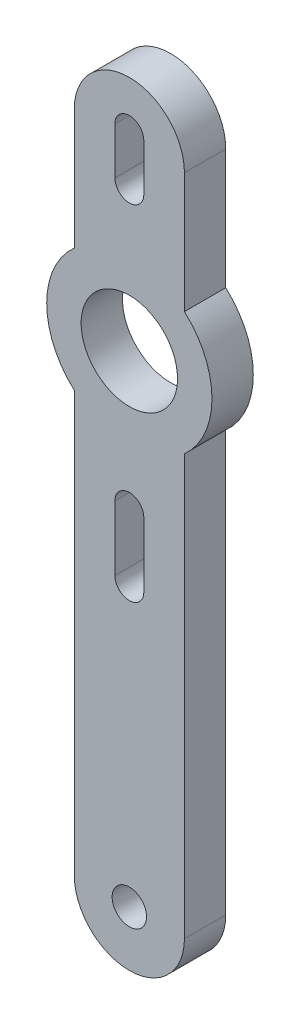
ISO-10303-21;
HEADER;
FILE_DESCRIPTION(('STEP AP214'),'2;1');
FILE_NAME('part.step','',(''),(''),'','','');
FILE_SCHEMA(('AUTOMOTIVE_DESIGN { 1 0 10303 214 1 1 1 1 }'));
ENDSEC;
DATA;
#1=APPLICATION_CONTEXT('core data for automotive mechanical design processes');
#2=APPLICATION_PROTOCOL_DEFINITION('international standard','automotive_design',2000,#1);
#3=PRODUCT_CONTEXT('',#1,'mechanical');
#4=PRODUCT('Part','Part','',(#3));
#5=PRODUCT_RELATED_PRODUCT_CATEGORY('part','',(#4));
#6=PRODUCT_DEFINITION_FORMATION('','',#4);
#7=PRODUCT_DEFINITION_CONTEXT('part definition',#1,'design');
#8=PRODUCT_DEFINITION('design','',#6,#7);
#9=PRODUCT_DEFINITION_SHAPE('','',#8);
#10=(LENGTH_UNIT() NAMED_UNIT(*) SI_UNIT(.MILLI.,.METRE.));
#11=(NAMED_UNIT(*) PLANE_ANGLE_UNIT() SI_UNIT($,.RADIAN.));
#12=(NAMED_UNIT(*) SI_UNIT($,.STERADIAN.) SOLID_ANGLE_UNIT());
#13=UNCERTAINTY_MEASURE_WITH_UNIT(LENGTH_MEASURE(1.E-05),#10,'distance_accuracy_value','');
#14=(GEOMETRIC_REPRESENTATION_CONTEXT(3) GLOBAL_UNCERTAINTY_ASSIGNED_CONTEXT((#13)) GLOBAL_UNIT_ASSIGNED_CONTEXT((#10,
#11,#12)) REPRESENTATION_CONTEXT('',''));
#15=CARTESIAN_POINT('',(0.,0.,0.));
#16=DIRECTION('',(0.,0.,1.));
#17=DIRECTION('',(1.,0.,0.));
#18=AXIS2_PLACEMENT_3D('',#15,#16,#17);
#19=CARTESIAN_POINT('',(316.545394726798,1591.82059889002,-3.));
#20=DIRECTION('',(0.,0.,1.));
#21=DIRECTION('',(1.,0.,0.));
#22=AXIS2_PLACEMENT_3D('',#19,#20,#21);
#23=CYLINDRICAL_SURFACE('',#22,6.00000000000006);
#24=CARTESIAN_POINT('',(316.545394726798,1591.82059889002,0.));
#25=DIRECTION('',(0.,0.,1.));
#26=DIRECTION('',(1.,0.,0.));
#27=AXIS2_PLACEMENT_3D('',#24,#25,#26);
#28=CIRCLE('',#27,6.00000000000006);
#29=CARTESIAN_POINT('',(312.545394726798,1596.29273484502,0.));
#30=VERTEX_POINT('',#29);
#31=CARTESIAN_POINT('',(312.545394726798,1587.34846293503,0.));
#32=VERTEX_POINT('',#31);
#33=EDGE_CURVE('E231',#30,#32,#28,.T.);
#34=ORIENTED_EDGE('',*,*,#33,.F.);
#35=DIRECTION('',(0.,0.,1.));
#36=VECTOR('',#35,1.);
#37=CARTESIAN_POINT('',(312.545394726798,1596.29273484502,-3.));
#38=LINE('',#37,#36);
#39=CARTESIAN_POINT('',(312.545394726798,1596.29273484502,-3.));
#40=VERTEX_POINT('',#39);
#41=EDGE_CURVE('E11',#40,#30,#38,.T.);
#42=ORIENTED_EDGE('',*,*,#41,.F.);
#43=CARTESIAN_POINT('',(316.545394726798,1591.82059889002,-3.));
#44=DIRECTION('',(0.,0.,1.));
#45=DIRECTION('',(1.,0.,0.));
#46=AXIS2_PLACEMENT_3D('',#43,#44,#45);
#47=CIRCLE('',#46,6.00000000000006);
#48=CARTESIAN_POINT('',(312.545394726798,1587.34846293503,-3.));
#49=VERTEX_POINT('',#48);
#50=EDGE_CURVE('E234',#40,#49,#47,.T.);
#51=ORIENTED_EDGE('',*,*,#50,.T.);
#52=DIRECTION('',(0.,0.,1.));
#53=VECTOR('',#52,1.);
#54=CARTESIAN_POINT('',(312.545394726798,1587.34846293503,-3.));
#55=LINE('',#54,#53);
#56=EDGE_CURVE('E43',#49,#32,#55,.T.);
#57=ORIENTED_EDGE('',*,*,#56,.T.);
#58=EDGE_LOOP('',(#34,#42,#51,#57));
#59=FACE_BOUND('',#58,.T.);
#60=ADVANCED_FACE('F40',(#59),#23,.T.);
#61=CARTESIAN_POINT('',(312.545394726798,1605.02468453959,-3.));
#62=DIRECTION('',(-1.,0.,0.));
#63=DIRECTION('',(0.,0.,1.));
#64=AXIS2_PLACEMENT_3D('',#61,#62,#63);
#65=PLANE('',#64);
#66=DIRECTION('',(0.,-1.,0.));
#67=VECTOR('',#66,1.);
#68=CARTESIAN_POINT('',(312.545394726798,1605.02468453959,0.));
#69=LINE('',#68,#67);
#70=CARTESIAN_POINT('',(312.545394726798,1605.02468453959,0.));
#71=VERTEX_POINT('',#70);
#72=EDGE_CURVE('E238',#71,#30,#69,.T.);
#73=ORIENTED_EDGE('',*,*,#72,.F.);
#74=DIRECTION('',(0.,0.,1.));
#75=VECTOR('',#74,1.);
#76=CARTESIAN_POINT('',(312.545394726798,1605.02468453959,-3.));
#77=LINE('',#76,#75);
#78=CARTESIAN_POINT('',(312.545394726798,1605.02468453959,-3.));
#79=VERTEX_POINT('',#78);
#80=EDGE_CURVE('E48',#79,#71,#77,.T.);
#81=ORIENTED_EDGE('',*,*,#80,.F.);
#82=DIRECTION('',(0.,-1.,0.));
#83=VECTOR('',#82,1.);
#84=CARTESIAN_POINT('',(312.545394726798,1605.02468453959,-3.));
#85=LINE('',#84,#83);
#86=EDGE_CURVE('E256',#79,#40,#85,.T.);
#87=ORIENTED_EDGE('',*,*,#86,.T.);
#88=ORIENTED_EDGE('',*,*,#41,.T.);
#89=EDGE_LOOP('',(#73,#81,#87,#88));
#90=FACE_BOUND('',#89,.T.);
#91=ADVANCED_FACE('F303',(#90),#65,.T.);
#92=CARTESIAN_POINT('',(316.545394726798,1605.02468453959,-3.));
#93=DIRECTION('',(0.,0.,1.));
#94=DIRECTION('',(1.,0.,0.));
#95=AXIS2_PLACEMENT_3D('',#92,#93,#94);
#96=CYLINDRICAL_SURFACE('',#95,3.99999999999986);
#97=CARTESIAN_POINT('',(316.545394726798,1605.02468453959,0.));
#98=DIRECTION('',(0.,0.,1.));
#99=DIRECTION('',(-1.,0.,0.));
#100=AXIS2_PLACEMENT_3D('',#97,#98,#99);
#101=CIRCLE('',#100,3.99999999999986);
#102=CARTESIAN_POINT('',(320.545394726798,1605.02468453959,0.));
#103=VERTEX_POINT('',#102);
#104=EDGE_CURVE('E276',#103,#71,#101,.T.);
#105=ORIENTED_EDGE('',*,*,#104,.F.);
#106=DIRECTION('',(0.,0.,1.));
#107=VECTOR('',#106,1.);
#108=CARTESIAN_POINT('',(320.545394726798,1605.02468453959,-3.));
#109=LINE('',#108,#107);
#110=CARTESIAN_POINT('',(320.545394726798,1605.02468453959,-3.));
#111=VERTEX_POINT('',#110);
#112=EDGE_CURVE('E282',#111,#103,#109,.T.);
#113=ORIENTED_EDGE('',*,*,#112,.F.);
#114=CARTESIAN_POINT('',(316.545394726798,1605.02468453959,-3.));
#115=DIRECTION('',(0.,0.,1.));
#116=DIRECTION('',(-1.,0.,0.));
#117=AXIS2_PLACEMENT_3D('',#114,#115,#116);
#118=CIRCLE('',#117,3.99999999999986);
#119=EDGE_CURVE('E253',#111,#79,#118,.T.);
#120=ORIENTED_EDGE('',*,*,#119,.T.);
#121=ORIENTED_EDGE('',*,*,#80,.T.);
#122=EDGE_LOOP('',(#105,#113,#120,#121));
#123=FACE_BOUND('',#122,.T.);
#124=ADVANCED_FACE('F323',(#123),#96,.T.);
#125=CARTESIAN_POINT('',(320.545394726798,1605.02468453959,-3.));
#126=DIRECTION('',(1.,0.,0.));
#127=DIRECTION('',(0.,0.,-1.));
#128=AXIS2_PLACEMENT_3D('',#125,#126,#127);
#129=PLANE('',#128);
#130=DIRECTION('',(0.,1.,0.));
#131=VECTOR('',#130,1.);
#132=CARTESIAN_POINT('',(320.545394726798,1605.02468453959,0.));
#133=LINE('',#132,#131);
#134=CARTESIAN_POINT('',(320.545394726798,1596.29273484502,0.));
#135=VERTEX_POINT('',#134);
#136=EDGE_CURVE('E273',#135,#103,#133,.T.);
#137=ORIENTED_EDGE('',*,*,#136,.F.);
#138=DIRECTION('',(0.,0.,1.));
#139=VECTOR('',#138,1.);
#140=CARTESIAN_POINT('',(320.545394726798,1596.29273484502,-3.));
#141=LINE('',#140,#139);
#142=CARTESIAN_POINT('',(320.545394726798,1596.29273484502,-3.));
#143=VERTEX_POINT('',#142);
#144=EDGE_CURVE('E284',#143,#135,#141,.T.);
#145=ORIENTED_EDGE('',*,*,#144,.F.);
#146=DIRECTION('',(0.,1.,0.));
#147=VECTOR('',#146,1.);
#148=CARTESIAN_POINT('',(320.545394726798,1605.02468453959,-3.));
#149=LINE('',#148,#147);
#150=EDGE_CURVE('E250',#143,#111,#149,.T.);
#151=ORIENTED_EDGE('',*,*,#150,.T.);
#152=ORIENTED_EDGE('',*,*,#112,.T.);
#153=EDGE_LOOP('',(#137,#145,#151,#152));
#154=FACE_BOUND('',#153,.T.);
#155=ADVANCED_FACE('F321',(#154),#129,.T.);
#156=CARTESIAN_POINT('',(316.545394726798,1591.82059889002,-3.));
#157=DIRECTION('',(0.,0.,1.));
#158=DIRECTION('',(1.,0.,0.));
#159=AXIS2_PLACEMENT_3D('',#156,#157,#158);
#160=CYLINDRICAL_SURFACE('',#159,6.00000000000027);
#161=CARTESIAN_POINT('',(316.545394726798,1591.82059889002,0.));
#162=DIRECTION('',(0.,0.,1.));
#163=DIRECTION('',(-1.,0.,0.));
#164=AXIS2_PLACEMENT_3D('',#161,#162,#163);
#165=CIRCLE('',#164,6.00000000000027);
#166=CARTESIAN_POINT('',(320.545394726798,1587.34846293503,0.));
#167=VERTEX_POINT('',#166);
#168=EDGE_CURVE('E270',#167,#135,#165,.T.);
#169=ORIENTED_EDGE('',*,*,#168,.F.);
#170=DIRECTION('',(0.,0.,1.));
#171=VECTOR('',#170,1.);
#172=CARTESIAN_POINT('',(320.545394726798,1587.34846293503,-3.));
#173=LINE('',#172,#171);
#174=CARTESIAN_POINT('',(320.545394726798,1587.34846293503,-3.));
#175=VERTEX_POINT('',#174);
#176=EDGE_CURVE('E286',#175,#167,#173,.T.);
#177=ORIENTED_EDGE('',*,*,#176,.F.);
#178=CARTESIAN_POINT('',(316.545394726798,1591.82059889002,-3.));
#179=DIRECTION('',(0.,0.,1.));
#180=DIRECTION('',(-1.,0.,0.));
#181=AXIS2_PLACEMENT_3D('',#178,#179,#180);
#182=CIRCLE('',#181,6.00000000000027);
#183=EDGE_CURVE('E247',#175,#143,#182,.T.);
#184=ORIENTED_EDGE('',*,*,#183,.T.);
#185=ORIENTED_EDGE('',*,*,#144,.T.);
#186=EDGE_LOOP('',(#169,#177,#184,#185));
#187=FACE_BOUND('',#186,.T.);
#188=ADVANCED_FACE('F317',(#187),#160,.T.);
#189=CARTESIAN_POINT('',(320.545394726798,1587.34846293503,-3.));
#190=DIRECTION('',(1.,0.,0.));
#191=DIRECTION('',(0.,0.,-1.));
#192=AXIS2_PLACEMENT_3D('',#189,#190,#191);
#193=PLANE('',#192);
#194=DIRECTION('',(0.,1.,0.));
#195=VECTOR('',#194,1.);
#196=CARTESIAN_POINT('',(320.545394726798,1587.34846293503,0.));
#197=LINE('',#196,#195);
#198=CARTESIAN_POINT('',(320.545394726798,1556.85824267123,0.));
#199=VERTEX_POINT('',#198);
#200=EDGE_CURVE('E267',#199,#167,#197,.T.);
#201=ORIENTED_EDGE('',*,*,#200,.F.);
#202=DIRECTION('',(0.,0.,1.));
#203=VECTOR('',#202,1.);
#204=CARTESIAN_POINT('',(320.545394726798,1556.85824267123,-3.));
#205=LINE('',#204,#203);
#206=CARTESIAN_POINT('',(320.545394726798,1556.85824267123,-3.));
#207=VERTEX_POINT('',#206);
#208=EDGE_CURVE('E288',#207,#199,#205,.T.);
#209=ORIENTED_EDGE('',*,*,#208,.F.);
#210=DIRECTION('',(0.,1.,0.));
#211=VECTOR('',#210,1.);
#212=CARTESIAN_POINT('',(320.545394726798,1587.34846293503,-3.));
#213=LINE('',#212,#211);
#214=EDGE_CURVE('E244',#207,#175,#213,.T.);
#215=ORIENTED_EDGE('',*,*,#214,.T.);
#216=ORIENTED_EDGE('',*,*,#176,.T.);
#217=EDGE_LOOP('',(#201,#209,#215,#216));
#218=FACE_BOUND('',#217,.T.);
#219=ADVANCED_FACE('F315',(#218),#193,.T.);
#220=CARTESIAN_POINT('',(316.545394726798,1556.85824267123,-3.));
#221=DIRECTION('',(0.,0.,1.));
#222=DIRECTION('',(1.,0.,0.));
#223=AXIS2_PLACEMENT_3D('',#220,#221,#222);
#224=CYLINDRICAL_SURFACE('',#223,3.99999999999984);
#225=CARTESIAN_POINT('',(316.545394726798,1556.85824267123,0.));
#226=DIRECTION('',(0.,0.,1.));
#227=DIRECTION('',(1.,0.,0.));
#228=AXIS2_PLACEMENT_3D('',#225,#226,#227);
#229=CIRCLE('',#228,3.99999999999984);
#230=CARTESIAN_POINT('',(312.545394726798,1556.85824267123,0.));
#231=VERTEX_POINT('',#230);
#232=EDGE_CURVE('E264',#231,#199,#229,.T.);
#233=ORIENTED_EDGE('',*,*,#232,.F.);
#234=DIRECTION('',(0.,0.,1.));
#235=VECTOR('',#234,1.);
#236=CARTESIAN_POINT('',(312.545394726798,1556.85824267123,-3.));
#237=LINE('',#236,#235);
#238=CARTESIAN_POINT('',(312.545394726798,1556.85824267123,-3.));
#239=VERTEX_POINT('',#238);
#240=EDGE_CURVE('E289',#239,#231,#237,.T.);
#241=ORIENTED_EDGE('',*,*,#240,.F.);
#242=CARTESIAN_POINT('',(316.545394726798,1556.85824267123,-3.));
#243=DIRECTION('',(0.,0.,1.));
#244=DIRECTION('',(1.,0.,0.));
#245=AXIS2_PLACEMENT_3D('',#242,#243,#244);
#246=CIRCLE('',#245,3.99999999999984);
#247=EDGE_CURVE('E241',#239,#207,#246,.T.);
#248=ORIENTED_EDGE('',*,*,#247,.T.);
#249=ORIENTED_EDGE('',*,*,#208,.T.);
#250=EDGE_LOOP('',(#233,#241,#248,#249));
#251=FACE_BOUND('',#250,.T.);
#252=ADVANCED_FACE('F311',(#251),#224,.T.);
#253=CARTESIAN_POINT('',(312.545394726798,1587.34846293503,-3.));
#254=DIRECTION('',(-1.,0.,0.));
#255=DIRECTION('',(0.,0.,1.));
#256=AXIS2_PLACEMENT_3D('',#253,#254,#255);
#257=PLANE('',#256);
#258=DIRECTION('',(0.,-1.,0.));
#259=VECTOR('',#258,1.);
#260=CARTESIAN_POINT('',(312.545394726798,1587.34846293503,0.));
#261=LINE('',#260,#259);
#262=EDGE_CURVE('E261',#32,#231,#261,.T.);
#263=ORIENTED_EDGE('',*,*,#262,.F.);
#264=ORIENTED_EDGE('',*,*,#56,.F.);
#265=DIRECTION('',(0.,-1.,0.));
#266=VECTOR('',#265,1.);
#267=CARTESIAN_POINT('',(312.545394726798,1587.34846293503,-3.));
#268=LINE('',#267,#266);
#269=EDGE_CURVE('E237',#49,#239,#268,.T.);
#270=ORIENTED_EDGE('',*,*,#269,.T.);
#271=ORIENTED_EDGE('',*,*,#240,.T.);
#272=EDGE_LOOP('',(#263,#264,#270,#271));
#273=FACE_BOUND('',#272,.T.);
#274=ADVANCED_FACE('F297',(#273),#257,.T.);
#275=CARTESIAN_POINT('',(316.545394726798,1591.82059889002,-3.));
#276=DIRECTION('',(0.,0.,1.));
#277=DIRECTION('',(1.,0.,0.));
#278=AXIS2_PLACEMENT_3D('',#275,#276,#277);
#279=PLANE('',#278);
#280=DIRECTION('',(0.,1.,0.));
#281=VECTOR('',#280,1.);
#282=CARTESIAN_POINT('',(317.595394726798,1581.87059889003,-3.));
#283=LINE('',#282,#281);
#284=CARTESIAN_POINT('',(317.595394726798,1577.17059889003,-3.));
#285=VERTEX_POINT('',#284);
#286=CARTESIAN_POINT('',(317.595394726798,1581.87059889003,-3.));
#287=VERTEX_POINT('',#286);
#288=EDGE_CURVE('E161',#285,#287,#283,.T.);
#289=ORIENTED_EDGE('',*,*,#288,.T.);
#290=CARTESIAN_POINT('',(316.545394726798,1581.87059889003,-3.));
#291=DIRECTION('',(0.,0.,1.));
#292=DIRECTION('',(1.,0.,0.));
#293=AXIS2_PLACEMENT_3D('',#290,#291,#292);
#294=CIRCLE('',#293,1.04999999999977);
#295=CARTESIAN_POINT('',(315.495394726798,1581.87059889003,-3.));
#296=VERTEX_POINT('',#295);
#297=EDGE_CURVE('E155',#287,#296,#294,.T.);
#298=ORIENTED_EDGE('',*,*,#297,.T.);
#299=DIRECTION('',(0.,-1.,0.));
#300=VECTOR('',#299,1.);
#301=CARTESIAN_POINT('',(315.495394726798,1581.87059889003,-3.));
#302=LINE('',#301,#300);
#303=CARTESIAN_POINT('',(315.495394726798,1577.17059889003,-3.));
#304=VERTEX_POINT('',#303);
#305=EDGE_CURVE('E164',#296,#304,#302,.T.);
#306=ORIENTED_EDGE('',*,*,#305,.T.);
#307=CARTESIAN_POINT('',(316.545394726798,1577.17059889003,-3.));
#308=DIRECTION('',(0.,0.,1.));
#309=DIRECTION('',(1.,0.,0.));
#310=AXIS2_PLACEMENT_3D('',#307,#308,#309);
#311=CIRCLE('',#310,1.04999999999977);
#312=EDGE_CURVE('E56',#304,#285,#311,.T.);
#313=ORIENTED_EDGE('',*,*,#312,.T.);
#314=EDGE_LOOP('',(#289,#298,#306,#313));
#315=FACE_BOUND('',#314,.T.);
#316=DIRECTION('',(0.,1.,0.));
#317=VECTOR('',#316,1.);
#318=CARTESIAN_POINT('',(317.595394726798,1605.57468453959,-3.));
#319=LINE('',#318,#317);
#320=CARTESIAN_POINT('',(317.595394726798,1602.17468453959,-3.));
#321=VERTEX_POINT('',#320);
#322=CARTESIAN_POINT('',(317.595394726798,1605.57468453959,-3.));
#323=VERTEX_POINT('',#322);
#324=EDGE_CURVE('E200',#321,#323,#319,.T.);
#325=ORIENTED_EDGE('',*,*,#324,.T.);
#326=CARTESIAN_POINT('',(316.545394726798,1605.57468453959,-3.));
#327=DIRECTION('',(0.,0.,1.));
#328=DIRECTION('',(1.,0.,0.));
#329=AXIS2_PLACEMENT_3D('',#326,#327,#328);
#330=CIRCLE('',#329,1.04999999999977);
#331=CARTESIAN_POINT('',(315.495394726798,1605.57468453959,-3.));
#332=VERTEX_POINT('',#331);
#333=EDGE_CURVE('E190',#323,#332,#330,.T.);
#334=ORIENTED_EDGE('',*,*,#333,.T.);
#335=DIRECTION('',(0.,-1.,0.));
#336=VECTOR('',#335,1.);
#337=CARTESIAN_POINT('',(315.495394726798,1605.57468453959,-3.));
#338=LINE('',#337,#336);
#339=CARTESIAN_POINT('',(315.495394726798,1602.17468453959,-3.));
#340=VERTEX_POINT('',#339);
#341=EDGE_CURVE('E193',#332,#340,#338,.T.);
#342=ORIENTED_EDGE('',*,*,#341,.T.);
#343=CARTESIAN_POINT('',(316.545394726798,1602.17468453959,-3.));
#344=DIRECTION('',(0.,0.,1.));
#345=DIRECTION('',(1.,0.,0.));
#346=AXIS2_PLACEMENT_3D('',#343,#344,#345);
#347=CIRCLE('',#346,1.04999999999977);
#348=EDGE_CURVE('E197',#340,#321,#347,.T.);
#349=ORIENTED_EDGE('',*,*,#348,.T.);
#350=EDGE_LOOP('',(#325,#334,#342,#349));
#351=FACE_BOUND('',#350,.T.);
#352=CARTESIAN_POINT('',(316.545394726798,1556.85824267123,-3.));
#353=DIRECTION('',(0.,0.,1.));
#354=DIRECTION('',(1.,0.,0.));
#355=AXIS2_PLACEMENT_3D('',#352,#353,#354);
#356=CIRCLE('',#355,1.24999999999997);
#357=CARTESIAN_POINT('',(317.795394726798,1556.85824267123,-3.));
#358=VERTEX_POINT('',#357);
#359=EDGE_CURVE('E222',#358,#358,#356,.T.);
#360=ORIENTED_EDGE('',*,*,#359,.T.);
#361=EDGE_LOOP('',(#360));
#362=FACE_BOUND('',#361,.T.);
#363=CARTESIAN_POINT('',(316.545394726798,1591.82059889002,-3.));
#364=DIRECTION('',(0.,0.,1.));
#365=DIRECTION('',(1.,0.,0.));
#366=AXIS2_PLACEMENT_3D('',#363,#364,#365);
#367=CIRCLE('',#366,3.49999999999999);
#368=CARTESIAN_POINT('',(320.045394726798,1591.82059889002,-3.));
#369=VERTEX_POINT('',#368);
#370=EDGE_CURVE('E228',#369,#369,#367,.T.);
#371=ORIENTED_EDGE('',*,*,#370,.T.);
#372=EDGE_LOOP('',(#371));
#373=FACE_BOUND('',#372,.T.);
#374=ORIENTED_EDGE('',*,*,#50,.F.);
#375=ORIENTED_EDGE('',*,*,#86,.F.);
#376=ORIENTED_EDGE('',*,*,#119,.F.);
#377=ORIENTED_EDGE('',*,*,#150,.F.);
#378=ORIENTED_EDGE('',*,*,#183,.F.);
#379=ORIENTED_EDGE('',*,*,#214,.F.);
#380=ORIENTED_EDGE('',*,*,#247,.F.);
#381=ORIENTED_EDGE('',*,*,#269,.F.);
#382=EDGE_LOOP('',(#374,#375,#376,#377,#378,#379,#380,#381));
#383=FACE_BOUND('',#382,.T.);
#384=ADVANCED_FACE('F168',(#315,#351,#362,#373,#383),#279,.F.);
#385=CARTESIAN_POINT('',(316.545394726798,1591.82059889002,0.));
#386=DIRECTION('',(0.,0.,1.));
#387=DIRECTION('',(1.,0.,0.));
#388=AXIS2_PLACEMENT_3D('',#385,#386,#387);
#389=PLANE('',#388);
#390=CARTESIAN_POINT('',(316.545394726798,1581.87059889003,0.));
#391=DIRECTION('',(0.,0.,1.));
#392=DIRECTION('',(1.,0.,0.));
#393=AXIS2_PLACEMENT_3D('',#390,#391,#392);
#394=CIRCLE('',#393,1.04999999999977);
#395=CARTESIAN_POINT('',(317.595394726798,1581.87059889003,0.));
#396=VERTEX_POINT('',#395);
#397=CARTESIAN_POINT('',(315.495394726798,1581.87059889003,0.));
#398=VERTEX_POINT('',#397);
#399=EDGE_CURVE('E64',#396,#398,#394,.T.);
#400=ORIENTED_EDGE('',*,*,#399,.F.);
#401=DIRECTION('',(0.,1.,0.));
#402=VECTOR('',#401,1.);
#403=CARTESIAN_POINT('',(317.595394726798,1581.87059889003,0.));
#404=LINE('',#403,#402);
#405=CARTESIAN_POINT('',(317.595394726798,1577.17059889003,0.));
#406=VERTEX_POINT('',#405);
#407=EDGE_CURVE('E171',#406,#396,#404,.T.);
#408=ORIENTED_EDGE('',*,*,#407,.F.);
#409=CARTESIAN_POINT('',(316.545394726798,1577.17059889003,0.));
#410=DIRECTION('',(0.,0.,1.));
#411=DIRECTION('',(1.,0.,0.));
#412=AXIS2_PLACEMENT_3D('',#409,#410,#411);
#413=CIRCLE('',#412,1.04999999999977);
#414=CARTESIAN_POINT('',(315.495394726798,1577.17059889003,0.));
#415=VERTEX_POINT('',#414);
#416=EDGE_CURVE('E174',#415,#406,#413,.T.);
#417=ORIENTED_EDGE('',*,*,#416,.F.);
#418=DIRECTION('',(0.,-1.,0.));
#419=VECTOR('',#418,1.);
#420=CARTESIAN_POINT('',(315.495394726798,1581.87059889003,0.));
#421=LINE('',#420,#419);
#422=EDGE_CURVE('E180',#398,#415,#421,.T.);
#423=ORIENTED_EDGE('',*,*,#422,.F.);
#424=EDGE_LOOP('',(#400,#408,#417,#423));
#425=FACE_BOUND('',#424,.T.);
#426=CARTESIAN_POINT('',(316.545394726798,1605.57468453959,0.));
#427=DIRECTION('',(0.,0.,1.));
#428=DIRECTION('',(1.,0.,0.));
#429=AXIS2_PLACEMENT_3D('',#426,#427,#428);
#430=CIRCLE('',#429,1.04999999999977);
#431=CARTESIAN_POINT('',(317.595394726798,1605.57468453959,0.));
#432=VERTEX_POINT('',#431);
#433=CARTESIAN_POINT('',(315.495394726798,1605.57468453959,0.));
#434=VERTEX_POINT('',#433);
#435=EDGE_CURVE('E186',#432,#434,#430,.T.);
#436=ORIENTED_EDGE('',*,*,#435,.F.);
#437=DIRECTION('',(0.,1.,0.));
#438=VECTOR('',#437,1.);
#439=CARTESIAN_POINT('',(317.595394726798,1605.57468453959,0.));
#440=LINE('',#439,#438);
#441=CARTESIAN_POINT('',(317.595394726798,1602.17468453959,0.));
#442=VERTEX_POINT('',#441);
#443=EDGE_CURVE('E194',#442,#432,#440,.T.);
#444=ORIENTED_EDGE('',*,*,#443,.F.);
#445=CARTESIAN_POINT('',(316.545394726798,1602.17468453959,0.));
#446=DIRECTION('',(0.,0.,1.));
#447=DIRECTION('',(1.,0.,0.));
#448=AXIS2_PLACEMENT_3D('',#445,#446,#447);
#449=CIRCLE('',#448,1.04999999999977);
#450=CARTESIAN_POINT('',(315.495394726798,1602.17468453959,0.));
#451=VERTEX_POINT('',#450);
#452=EDGE_CURVE('E208',#451,#442,#449,.T.);
#453=ORIENTED_EDGE('',*,*,#452,.F.);
#454=DIRECTION('',(0.,-1.,0.));
#455=VECTOR('',#454,1.);
#456=CARTESIAN_POINT('',(315.495394726798,1605.57468453959,0.));
#457=LINE('',#456,#455);
#458=EDGE_CURVE('E205',#434,#451,#457,.T.);
#459=ORIENTED_EDGE('',*,*,#458,.F.);
#460=EDGE_LOOP('',(#436,#444,#453,#459));
#461=FACE_BOUND('',#460,.T.);
#462=CARTESIAN_POINT('',(316.545394726798,1556.85824267123,0.));
#463=DIRECTION('',(0.,0.,1.));
#464=DIRECTION('',(1.,0.,0.));
#465=AXIS2_PLACEMENT_3D('',#462,#463,#464);
#466=CIRCLE('',#465,1.24999999999997);
#467=CARTESIAN_POINT('',(317.795394726798,1556.85824267123,0.));
#468=VERTEX_POINT('',#467);
#469=EDGE_CURVE('E215',#468,#468,#466,.T.);
#470=ORIENTED_EDGE('',*,*,#469,.F.);
#471=EDGE_LOOP('',(#470));
#472=FACE_BOUND('',#471,.T.);
#473=CARTESIAN_POINT('',(316.545394726798,1591.82059889002,0.));
#474=DIRECTION('',(0.,0.,1.));
#475=DIRECTION('',(1.,0.,0.));
#476=AXIS2_PLACEMENT_3D('',#473,#474,#475);
#477=CIRCLE('',#476,3.49999999999999);
#478=CARTESIAN_POINT('',(320.045394726798,1591.82059889002,0.));
#479=VERTEX_POINT('',#478);
#480=EDGE_CURVE('E225',#479,#479,#477,.T.);
#481=ORIENTED_EDGE('',*,*,#480,.F.);
#482=EDGE_LOOP('',(#481));
#483=FACE_BOUND('',#482,.T.);
#484=ORIENTED_EDGE('',*,*,#33,.T.);
#485=ORIENTED_EDGE('',*,*,#262,.T.);
#486=ORIENTED_EDGE('',*,*,#232,.T.);
#487=ORIENTED_EDGE('',*,*,#200,.T.);
#488=ORIENTED_EDGE('',*,*,#168,.T.);
#489=ORIENTED_EDGE('',*,*,#136,.T.);
#490=ORIENTED_EDGE('',*,*,#104,.T.);
#491=ORIENTED_EDGE('',*,*,#72,.T.);
#492=EDGE_LOOP('',(#484,#485,#486,#487,#488,#489,#490,#491));
#493=FACE_BOUND('',#492,.T.);
#494=ADVANCED_FACE('F299',(#425,#461,#472,#483,#493),#389,.T.);
#495=CARTESIAN_POINT('',(316.545394726798,1591.82059889002,-3.));
#496=DIRECTION('',(0.,0.,1.));
#497=DIRECTION('',(1.,0.,0.));
#498=AXIS2_PLACEMENT_3D('',#495,#496,#497);
#499=CYLINDRICAL_SURFACE('',#498,3.49999999999999);
#500=ORIENTED_EDGE('',*,*,#370,.F.);
#501=EDGE_LOOP('',(#500));
#502=FACE_BOUND('',#501,.T.);
#503=ORIENTED_EDGE('',*,*,#480,.T.);
#504=EDGE_LOOP('',(#503));
#505=FACE_BOUND('',#504,.T.);
#506=ADVANCED_FACE('F405',(#502,#505),#499,.F.);
#507=CARTESIAN_POINT('',(316.545394726798,1556.85824267123,-3.));
#508=DIRECTION('',(0.,0.,1.));
#509=DIRECTION('',(1.,0.,0.));
#510=AXIS2_PLACEMENT_3D('',#507,#508,#509);
#511=CYLINDRICAL_SURFACE('',#510,1.24999999999997);
#512=ORIENTED_EDGE('',*,*,#359,.F.);
#513=EDGE_LOOP('',(#512));
#514=FACE_BOUND('',#513,.T.);
#515=ORIENTED_EDGE('',*,*,#469,.T.);
#516=EDGE_LOOP('',(#515));
#517=FACE_BOUND('',#516,.T.);
#518=ADVANCED_FACE('F416',(#514,#517),#511,.F.);
#519=CARTESIAN_POINT('',(316.545394726798,1605.57468453959,-3.));
#520=DIRECTION('',(0.,0.,1.));
#521=DIRECTION('',(1.,0.,0.));
#522=AXIS2_PLACEMENT_3D('',#519,#520,#521);
#523=CYLINDRICAL_SURFACE('',#522,1.04999999999977);
#524=ORIENTED_EDGE('',*,*,#435,.T.);
#525=DIRECTION('',(0.,0.,1.));
#526=VECTOR('',#525,1.);
#527=CARTESIAN_POINT('',(315.495394726798,1605.57468453959,-3.));
#528=LINE('',#527,#526);
#529=EDGE_CURVE('E203',#332,#434,#528,.T.);
#530=ORIENTED_EDGE('',*,*,#529,.F.);
#531=ORIENTED_EDGE('',*,*,#333,.F.);
#532=DIRECTION('',(0.,0.,1.));
#533=VECTOR('',#532,1.);
#534=CARTESIAN_POINT('',(317.595394726798,1605.57468453959,-3.));
#535=LINE('',#534,#533);
#536=EDGE_CURVE('E213',#323,#432,#535,.T.);
#537=ORIENTED_EDGE('',*,*,#536,.T.);
#538=EDGE_LOOP('',(#524,#530,#531,#537));
#539=FACE_BOUND('',#538,.T.);
#540=ADVANCED_FACE('F427',(#539),#523,.F.);
#541=CARTESIAN_POINT('',(317.595394726798,1605.57468453959,-3.));
#542=DIRECTION('',(1.,0.,0.));
#543=DIRECTION('',(0.,0.,-1.));
#544=AXIS2_PLACEMENT_3D('',#541,#542,#543);
#545=PLANE('',#544);
#546=ORIENTED_EDGE('',*,*,#443,.T.);
#547=ORIENTED_EDGE('',*,*,#536,.F.);
#548=ORIENTED_EDGE('',*,*,#324,.F.);
#549=DIRECTION('',(0.,0.,1.));
#550=VECTOR('',#549,1.);
#551=CARTESIAN_POINT('',(317.595394726798,1602.17468453959,-3.));
#552=LINE('',#551,#550);
#553=EDGE_CURVE('E216',#321,#442,#552,.T.);
#554=ORIENTED_EDGE('',*,*,#553,.T.);
#555=EDGE_LOOP('',(#546,#547,#548,#554));
#556=FACE_BOUND('',#555,.T.);
#557=ADVANCED_FACE('F438',(#556),#545,.F.);
#558=CARTESIAN_POINT('',(316.545394726798,1602.17468453959,-3.));
#559=DIRECTION('',(0.,0.,1.));
#560=DIRECTION('',(1.,0.,0.));
#561=AXIS2_PLACEMENT_3D('',#558,#559,#560);
#562=CYLINDRICAL_SURFACE('',#561,1.04999999999977);
#563=ORIENTED_EDGE('',*,*,#452,.T.);
#564=ORIENTED_EDGE('',*,*,#553,.F.);
#565=ORIENTED_EDGE('',*,*,#348,.F.);
#566=DIRECTION('',(0.,0.,1.));
#567=VECTOR('',#566,1.);
#568=CARTESIAN_POINT('',(315.495394726798,1602.17468453959,-3.));
#569=LINE('',#568,#567);
#570=EDGE_CURVE('E218',#340,#451,#569,.T.);
#571=ORIENTED_EDGE('',*,*,#570,.T.);
#572=EDGE_LOOP('',(#563,#564,#565,#571));
#573=FACE_BOUND('',#572,.T.);
#574=ADVANCED_FACE('F449',(#573),#562,.F.);
#575=CARTESIAN_POINT('',(315.495394726798,1605.57468453959,-3.));
#576=DIRECTION('',(-1.,0.,0.));
#577=DIRECTION('',(0.,0.,1.));
#578=AXIS2_PLACEMENT_3D('',#575,#576,#577);
#579=PLANE('',#578);
#580=ORIENTED_EDGE('',*,*,#458,.T.);
#581=ORIENTED_EDGE('',*,*,#570,.F.);
#582=ORIENTED_EDGE('',*,*,#341,.F.);
#583=ORIENTED_EDGE('',*,*,#529,.T.);
#584=EDGE_LOOP('',(#580,#581,#582,#583));
#585=FACE_BOUND('',#584,.T.);
#586=ADVANCED_FACE('F460',(#585),#579,.F.);
#587=CARTESIAN_POINT('',(316.545394726798,1581.87059889003,-3.));
#588=DIRECTION('',(0.,0.,1.));
#589=DIRECTION('',(1.,0.,0.));
#590=AXIS2_PLACEMENT_3D('',#587,#588,#589);
#591=CYLINDRICAL_SURFACE('',#590,1.04999999999977);
#592=ORIENTED_EDGE('',*,*,#399,.T.);
#593=DIRECTION('',(0.,0.,1.));
#594=VECTOR('',#593,1.);
#595=CARTESIAN_POINT('',(315.495394726798,1581.87059889003,-3.));
#596=LINE('',#595,#594);
#597=EDGE_CURVE('E151',#296,#398,#596,.T.);
#598=ORIENTED_EDGE('',*,*,#597,.F.);
#599=ORIENTED_EDGE('',*,*,#297,.F.);
#600=DIRECTION('',(0.,0.,1.));
#601=VECTOR('',#600,1.);
#602=CARTESIAN_POINT('',(317.595394726798,1581.87059889003,-3.));
#603=LINE('',#602,#601);
#604=EDGE_CURVE('E184',#287,#396,#603,.T.);
#605=ORIENTED_EDGE('',*,*,#604,.T.);
#606=EDGE_LOOP('',(#592,#598,#599,#605));
#607=FACE_BOUND('',#606,.T.);
#608=ADVANCED_FACE('F153',(#607),#591,.F.);
#609=CARTESIAN_POINT('',(317.595394726798,1581.87059889003,-3.));
#610=DIRECTION('',(1.,0.,0.));
#611=DIRECTION('',(0.,0.,-1.));
#612=AXIS2_PLACEMENT_3D('',#609,#610,#611);
#613=PLANE('',#612);
#614=ORIENTED_EDGE('',*,*,#407,.T.);
#615=ORIENTED_EDGE('',*,*,#604,.F.);
#616=ORIENTED_EDGE('',*,*,#288,.F.);
#617=DIRECTION('',(0.,0.,1.));
#618=VECTOR('',#617,1.);
#619=CARTESIAN_POINT('',(317.595394726798,1577.17059889003,-3.));
#620=LINE('',#619,#618);
#621=EDGE_CURVE('E187',#285,#406,#620,.T.);
#622=ORIENTED_EDGE('',*,*,#621,.T.);
#623=EDGE_LOOP('',(#614,#615,#616,#622));
#624=FACE_BOUND('',#623,.T.);
#625=ADVANCED_FACE('F481',(#624),#613,.F.);
#626=CARTESIAN_POINT('',(316.545394726798,1577.17059889003,-3.));
#627=DIRECTION('',(0.,0.,1.));
#628=DIRECTION('',(1.,0.,0.));
#629=AXIS2_PLACEMENT_3D('',#626,#627,#628);
#630=CYLINDRICAL_SURFACE('',#629,1.04999999999977);
#631=ORIENTED_EDGE('',*,*,#416,.T.);
#632=ORIENTED_EDGE('',*,*,#621,.F.);
#633=ORIENTED_EDGE('',*,*,#312,.F.);
#634=DIRECTION('',(0.,0.,1.));
#635=VECTOR('',#634,1.);
#636=CARTESIAN_POINT('',(315.495394726798,1577.17059889003,-3.));
#637=LINE('',#636,#635);
#638=EDGE_CURVE('E160',#304,#415,#637,.T.);
#639=ORIENTED_EDGE('',*,*,#638,.T.);
#640=EDGE_LOOP('',(#631,#632,#633,#639));
#641=FACE_BOUND('',#640,.T.);
#642=ADVANCED_FACE('F491',(#641),#630,.F.);
#643=CARTESIAN_POINT('',(315.495394726798,1581.87059889003,-3.));
#644=DIRECTION('',(-1.,0.,0.));
#645=DIRECTION('',(0.,0.,1.));
#646=AXIS2_PLACEMENT_3D('',#643,#644,#645);
#647=PLANE('',#646);
#648=ORIENTED_EDGE('',*,*,#422,.T.);
#649=ORIENTED_EDGE('',*,*,#638,.F.);
#650=ORIENTED_EDGE('',*,*,#305,.F.);
#651=ORIENTED_EDGE('',*,*,#597,.T.);
#652=EDGE_LOOP('',(#648,#649,#650,#651));
#653=FACE_BOUND('',#652,.T.);
#654=ADVANCED_FACE('F165',(#653),#647,.F.);
#655=CLOSED_SHELL('',(#60,#91,#124,#155,#188,#219,#252,#274,#384,#494,#506,#518,#540,#557,#574,
#586,#608,#625,#642,#654));
#656=MANIFOLD_SOLID_BREP('B2',#655);
#657=ADVANCED_BREP_SHAPE_REPRESENTATION('',(#18,#656),#14);
#658=SHAPE_DEFINITION_REPRESENTATION(#9,#657);
ENDSEC;
END-ISO-10303-21;
